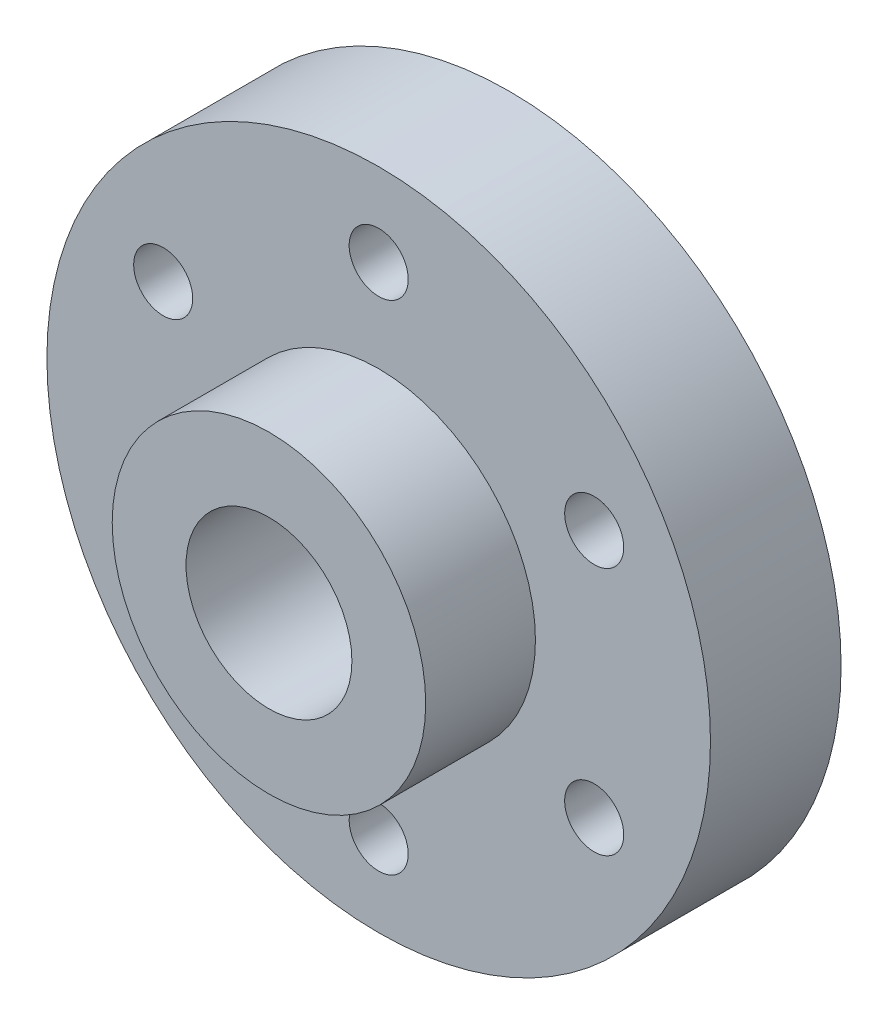
ISO-10303-21;
HEADER;
FILE_DESCRIPTION(('STEP AP214'),'2;1');
FILE_NAME('part.step','',(''),(''),'','','');
FILE_SCHEMA(('AUTOMOTIVE_DESIGN { 1 0 10303 214 1 1 1 1 }'));
ENDSEC;
DATA;
#1=APPLICATION_CONTEXT('core data for automotive mechanical design processes');
#2=APPLICATION_PROTOCOL_DEFINITION('international standard','automotive_design',2000,#1);
#3=PRODUCT_CONTEXT('',#1,'mechanical');
#4=PRODUCT('Part','Part','',(#3));
#5=PRODUCT_RELATED_PRODUCT_CATEGORY('part','',(#4));
#6=PRODUCT_DEFINITION_FORMATION('','',#4);
#7=PRODUCT_DEFINITION_CONTEXT('part definition',#1,'design');
#8=PRODUCT_DEFINITION('design','',#6,#7);
#9=PRODUCT_DEFINITION_SHAPE('','',#8);
#10=(LENGTH_UNIT() NAMED_UNIT(*) SI_UNIT(.MILLI.,.METRE.));
#11=(NAMED_UNIT(*) PLANE_ANGLE_UNIT() SI_UNIT($,.RADIAN.));
#12=(NAMED_UNIT(*) SI_UNIT($,.STERADIAN.) SOLID_ANGLE_UNIT());
#13=UNCERTAINTY_MEASURE_WITH_UNIT(LENGTH_MEASURE(1.E-05),#10,'distance_accuracy_value','');
#14=(GEOMETRIC_REPRESENTATION_CONTEXT(3) GLOBAL_UNCERTAINTY_ASSIGNED_CONTEXT((#13)) GLOBAL_UNIT_ASSIGNED_CONTEXT((#10,
#11,#12)) REPRESENTATION_CONTEXT('',''));
#15=CARTESIAN_POINT('',(0.,0.,0.));
#16=DIRECTION('',(0.,0.,1.));
#17=DIRECTION('',(1.,0.,0.));
#18=AXIS2_PLACEMENT_3D('',#15,#16,#17);
#19=CARTESIAN_POINT('',(0.,0.,5.));
#20=DIRECTION('',(0.,0.,1.));
#21=DIRECTION('',(1.,0.,0.));
#22=AXIS2_PLACEMENT_3D('',#19,#20,#21);
#23=PLANE('',#22);
#24=CARTESIAN_POINT('',(8.24889197104672,4.7625000000001,5.));
#25=DIRECTION('',(0.,0.,1.));
#26=DIRECTION('',(0.50000000000001,-0.866025403784433,0.));
#27=AXIS2_PLACEMENT_3D('',#24,#25,#26);
#28=CIRCLE('',#27,1.1303);
#29=CARTESIAN_POINT('',(8.81404197104673,3.78363148610255,5.));
#30=VERTEX_POINT('',#29);
#31=EDGE_CURVE('E72',#30,#30,#28,.T.);
#32=ORIENTED_EDGE('',*,*,#31,.F.);
#33=EDGE_LOOP('',(#32));
#34=FACE_BOUND('',#33,.T.);
#35=CARTESIAN_POINT('',(8.24889197104682,-4.76249999999992,5.));
#36=DIRECTION('',(0.,0.,1.));
#37=DIRECTION('',(-0.499999999999992,-0.866025403784443,0.));
#38=AXIS2_PLACEMENT_3D('',#35,#36,#37);
#39=CIRCLE('',#38,1.1303);
#40=CARTESIAN_POINT('',(7.68374197104683,-5.74136851389748,5.));
#41=VERTEX_POINT('',#40);
#42=EDGE_CURVE('E71',#41,#41,#39,.T.);
#43=ORIENTED_EDGE('',*,*,#42,.F.);
#44=EDGE_LOOP('',(#43));
#45=FACE_BOUND('',#44,.T.);
#46=CARTESIAN_POINT('',(0.,-9.525,5.));
#47=DIRECTION('',(0.,0.,1.));
#48=DIRECTION('',(-1.,0.,0.));
#49=AXIS2_PLACEMENT_3D('',#46,#47,#48);
#50=CIRCLE('',#49,1.1303);
#51=CARTESIAN_POINT('',(-1.1303,-9.525,5.));
#52=VERTEX_POINT('',#51);
#53=EDGE_CURVE('E78',#52,#52,#50,.T.);
#54=ORIENTED_EDGE('',*,*,#53,.F.);
#55=EDGE_LOOP('',(#54));
#56=FACE_BOUND('',#55,.T.);
#57=CARTESIAN_POINT('',(-8.24889197104676,-4.76250000000004,5.));
#58=DIRECTION('',(0.,0.,1.));
#59=DIRECTION('',(-0.500000000000004,0.866025403784436,0.));
#60=AXIS2_PLACEMENT_3D('',#57,#58,#59);
#61=CIRCLE('',#60,1.1303);
#62=CARTESIAN_POINT('',(-8.81404197104676,-3.78363148610249,5.));
#63=VERTEX_POINT('',#62);
#64=EDGE_CURVE('E84',#63,#63,#61,.T.);
#65=ORIENTED_EDGE('',*,*,#64,.F.);
#66=EDGE_LOOP('',(#65));
#67=FACE_BOUND('',#66,.T.);
#68=CARTESIAN_POINT('',(-8.24889197104679,4.76249999999998,5.));
#69=DIRECTION('',(0.,0.,1.));
#70=DIRECTION('',(0.499999999999998,0.86602540378444,0.));
#71=AXIS2_PLACEMENT_3D('',#68,#69,#70);
#72=CIRCLE('',#71,1.1303);
#73=CARTESIAN_POINT('',(-7.68374197104679,5.74136851389753,5.));
#74=VERTEX_POINT('',#73);
#75=EDGE_CURVE('E64',#74,#74,#72,.T.);
#76=ORIENTED_EDGE('',*,*,#75,.F.);
#77=EDGE_LOOP('',(#76));
#78=FACE_BOUND('',#77,.T.);
#79=CARTESIAN_POINT('',(0.,9.525,5.));
#80=DIRECTION('',(0.,0.,1.));
#81=DIRECTION('',(1.,0.,0.));
#82=AXIS2_PLACEMENT_3D('',#79,#80,#81);
#83=CIRCLE('',#82,1.1303);
#84=CARTESIAN_POINT('',(1.1303,9.525,5.));
#85=VERTEX_POINT('',#84);
#86=EDGE_CURVE('E58',#85,#85,#83,.T.);
#87=ORIENTED_EDGE('',*,*,#86,.F.);
#88=EDGE_LOOP('',(#87));
#89=FACE_BOUND('',#88,.T.);
#90=CARTESIAN_POINT('',(0.,0.,5.));
#91=DIRECTION('',(0.,0.,1.));
#92=DIRECTION('',(1.,0.,0.));
#93=AXIS2_PLACEMENT_3D('',#90,#91,#92);
#94=CIRCLE('',#93,12.7);
#95=CARTESIAN_POINT('',(12.7,0.,5.));
#96=VERTEX_POINT('',#95);
#97=EDGE_CURVE('E10',#96,#96,#94,.T.);
#98=ORIENTED_EDGE('',*,*,#97,.T.);
#99=EDGE_LOOP('',(#98));
#100=FACE_BOUND('',#99,.T.);
#101=CARTESIAN_POINT('',(0.,0.,5.));
#102=DIRECTION('',(0.,0.,1.));
#103=DIRECTION('',(1.,0.,0.));
#104=AXIS2_PLACEMENT_3D('',#101,#102,#103);
#105=CIRCLE('',#104,6.);
#106=CARTESIAN_POINT('',(6.,0.,5.));
#107=VERTEX_POINT('',#106);
#108=EDGE_CURVE('E47',#107,#107,#105,.T.);
#109=ORIENTED_EDGE('',*,*,#108,.F.);
#110=EDGE_LOOP('',(#109));
#111=FACE_BOUND('',#110,.T.);
#112=ADVANCED_FACE('F31',(#34,#45,#56,#67,#78,#89,#100,#111),#23,.T.);
#113=CARTESIAN_POINT('',(0.,0.,0.));
#114=DIRECTION('',(0.,0.,1.));
#115=DIRECTION('',(1.,0.,0.));
#116=AXIS2_PLACEMENT_3D('',#113,#114,#115);
#117=PLANE('',#116);
#118=CARTESIAN_POINT('',(8.24889197104672,4.7625000000001,0.));
#119=DIRECTION('',(0.,0.,1.));
#120=DIRECTION('',(1.,0.,0.));
#121=AXIS2_PLACEMENT_3D('',#118,#119,#120);
#122=CIRCLE('',#121,1.1303);
#123=CARTESIAN_POINT('',(9.37919197104672,4.7625000000001,0.));
#124=VERTEX_POINT('',#123);
#125=EDGE_CURVE('E68',#124,#124,#122,.F.);
#126=ORIENTED_EDGE('',*,*,#125,.F.);
#127=EDGE_LOOP('',(#126));
#128=FACE_BOUND('',#127,.T.);
#129=CARTESIAN_POINT('',(8.24889197104682,-4.76249999999992,0.));
#130=DIRECTION('',(0.,0.,1.));
#131=DIRECTION('',(1.,0.,0.));
#132=AXIS2_PLACEMENT_3D('',#129,#130,#131);
#133=CIRCLE('',#132,1.1303);
#134=CARTESIAN_POINT('',(9.37919197104682,-4.76249999999992,0.));
#135=VERTEX_POINT('',#134);
#136=EDGE_CURVE('E75',#135,#135,#133,.F.);
#137=ORIENTED_EDGE('',*,*,#136,.F.);
#138=EDGE_LOOP('',(#137));
#139=FACE_BOUND('',#138,.T.);
#140=CARTESIAN_POINT('',(0.,-9.525,0.));
#141=DIRECTION('',(0.,0.,1.));
#142=DIRECTION('',(1.,0.,0.));
#143=AXIS2_PLACEMENT_3D('',#140,#141,#142);
#144=CIRCLE('',#143,1.1303);
#145=CARTESIAN_POINT('',(1.1303,-9.525,0.));
#146=VERTEX_POINT('',#145);
#147=EDGE_CURVE('E81',#146,#146,#144,.F.);
#148=ORIENTED_EDGE('',*,*,#147,.F.);
#149=EDGE_LOOP('',(#148));
#150=FACE_BOUND('',#149,.T.);
#151=CARTESIAN_POINT('',(-8.24889197104676,-4.76250000000004,0.));
#152=DIRECTION('',(0.,0.,1.));
#153=DIRECTION('',(1.,0.,0.));
#154=AXIS2_PLACEMENT_3D('',#151,#152,#153);
#155=CIRCLE('',#154,1.1303);
#156=CARTESIAN_POINT('',(-7.11859197104676,-4.76250000000004,0.));
#157=VERTEX_POINT('',#156);
#158=EDGE_CURVE('E67',#157,#157,#155,.F.);
#159=ORIENTED_EDGE('',*,*,#158,.F.);
#160=EDGE_LOOP('',(#159));
#161=FACE_BOUND('',#160,.T.);
#162=CARTESIAN_POINT('',(-8.24889197104679,4.76249999999998,0.));
#163=DIRECTION('',(0.,0.,1.));
#164=DIRECTION('',(1.,0.,0.));
#165=AXIS2_PLACEMENT_3D('',#162,#163,#164);
#166=CIRCLE('',#165,1.1303);
#167=CARTESIAN_POINT('',(-7.11859197104679,4.76249999999998,0.));
#168=VERTEX_POINT('',#167);
#169=EDGE_CURVE('E61',#168,#168,#166,.F.);
#170=ORIENTED_EDGE('',*,*,#169,.F.);
#171=EDGE_LOOP('',(#170));
#172=FACE_BOUND('',#171,.T.);
#173=CARTESIAN_POINT('',(0.,9.525,0.));
#174=DIRECTION('',(0.,0.,1.));
#175=DIRECTION('',(1.,0.,0.));
#176=AXIS2_PLACEMENT_3D('',#173,#174,#175);
#177=CIRCLE('',#176,1.1303);
#178=CARTESIAN_POINT('',(1.1303,9.525,0.));
#179=VERTEX_POINT('',#178);
#180=EDGE_CURVE('E55',#179,#179,#177,.F.);
#181=ORIENTED_EDGE('',*,*,#180,.F.);
#182=EDGE_LOOP('',(#181));
#183=FACE_BOUND('',#182,.T.);
#184=CARTESIAN_POINT('',(0.,0.,0.));
#185=DIRECTION('',(0.,0.,1.));
#186=DIRECTION('',(1.,0.,0.));
#187=AXIS2_PLACEMENT_3D('',#184,#185,#186);
#188=CIRCLE('',#187,12.7);
#189=CARTESIAN_POINT('',(12.7,0.,0.));
#190=VERTEX_POINT('',#189);
#191=EDGE_CURVE('E35',#190,#190,#188,.T.);
#192=ORIENTED_EDGE('',*,*,#191,.F.);
#193=EDGE_LOOP('',(#192));
#194=FACE_BOUND('',#193,.T.);
#195=CARTESIAN_POINT('',(0.,0.,0.));
#196=DIRECTION('',(0.,0.,1.));
#197=DIRECTION('',(1.,0.,0.));
#198=AXIS2_PLACEMENT_3D('',#195,#196,#197);
#199=CIRCLE('',#198,3.175);
#200=CARTESIAN_POINT('',(3.175,0.,0.));
#201=VERTEX_POINT('',#200);
#202=EDGE_CURVE('E42',#201,#201,#199,.T.);
#203=ORIENTED_EDGE('',*,*,#202,.T.);
#204=EDGE_LOOP('',(#203));
#205=FACE_BOUND('',#204,.T.);
#206=ADVANCED_FACE('F97',(#128,#139,#150,#161,#172,#183,#194,#205),#117,.F.);
#207=CARTESIAN_POINT('',(0.,0.,5.));
#208=DIRECTION('',(0.,0.,-1.));
#209=DIRECTION('',(-1.,0.,0.));
#210=AXIS2_PLACEMENT_3D('',#207,#208,#209);
#211=CYLINDRICAL_SURFACE('',#210,12.7);
#212=ORIENTED_EDGE('',*,*,#97,.F.);
#213=EDGE_LOOP('',(#212));
#214=FACE_BOUND('',#213,.T.);
#215=ORIENTED_EDGE('',*,*,#191,.T.);
#216=EDGE_LOOP('',(#215));
#217=FACE_BOUND('',#216,.T.);
#218=ADVANCED_FACE('F33',(#214,#217),#211,.T.);
#219=CARTESIAN_POINT('',(0.,0.,5.));
#220=DIRECTION('',(0.,0.,-1.));
#221=DIRECTION('',(-1.,0.,0.));
#222=AXIS2_PLACEMENT_3D('',#219,#220,#221);
#223=CYLINDRICAL_SURFACE('',#222,3.175);
#224=ORIENTED_EDGE('',*,*,#202,.F.);
#225=EDGE_LOOP('',(#224));
#226=FACE_BOUND('',#225,.T.);
#227=CARTESIAN_POINT('',(0.,0.,9.2));
#228=DIRECTION('',(0.,0.,1.));
#229=DIRECTION('',(1.,0.,0.));
#230=AXIS2_PLACEMENT_3D('',#227,#228,#229);
#231=CIRCLE('',#230,3.175);
#232=CARTESIAN_POINT('',(3.175,0.,9.2));
#233=VERTEX_POINT('',#232);
#234=EDGE_CURVE('E50',#233,#233,#231,.T.);
#235=ORIENTED_EDGE('',*,*,#234,.T.);
#236=EDGE_LOOP('',(#235));
#237=FACE_BOUND('',#236,.T.);
#238=ADVANCED_FACE('F119',(#226,#237),#223,.F.);
#239=CARTESIAN_POINT('',(0.,0.,9.2));
#240=DIRECTION('',(0.,0.,1.));
#241=DIRECTION('',(1.,0.,0.));
#242=AXIS2_PLACEMENT_3D('',#239,#240,#241);
#243=PLANE('',#242);
#244=CARTESIAN_POINT('',(0.,0.,9.2));
#245=DIRECTION('',(0.,0.,1.));
#246=DIRECTION('',(1.,0.,0.));
#247=AXIS2_PLACEMENT_3D('',#244,#245,#246);
#248=CIRCLE('',#247,6.);
#249=CARTESIAN_POINT('',(6.,0.,9.2));
#250=VERTEX_POINT('',#249);
#251=EDGE_CURVE('E46',#250,#250,#248,.T.);
#252=ORIENTED_EDGE('',*,*,#251,.T.);
#253=EDGE_LOOP('',(#252));
#254=FACE_BOUND('',#253,.T.);
#255=ORIENTED_EDGE('',*,*,#234,.F.);
#256=EDGE_LOOP('',(#255));
#257=FACE_BOUND('',#256,.T.);
#258=ADVANCED_FACE('F109',(#254,#257),#243,.T.);
#259=CARTESIAN_POINT('',(0.,0.,9.2));
#260=DIRECTION('',(0.,0.,-1.));
#261=DIRECTION('',(-1.,0.,0.));
#262=AXIS2_PLACEMENT_3D('',#259,#260,#261);
#263=CYLINDRICAL_SURFACE('',#262,6.);
#264=ORIENTED_EDGE('',*,*,#251,.F.);
#265=EDGE_LOOP('',(#264));
#266=FACE_BOUND('',#265,.T.);
#267=ORIENTED_EDGE('',*,*,#108,.T.);
#268=EDGE_LOOP('',(#267));
#269=FACE_BOUND('',#268,.T.);
#270=ADVANCED_FACE('F106',(#266,#269),#263,.T.);
#271=CARTESIAN_POINT('',(0.,9.525,-0.00100000000000013));
#272=DIRECTION('',(0.,0.,1.));
#273=DIRECTION('',(1.,0.,0.));
#274=AXIS2_PLACEMENT_3D('',#271,#272,#273);
#275=CYLINDRICAL_SURFACE('',#274,1.1303);
#276=ORIENTED_EDGE('',*,*,#86,.T.);
#277=EDGE_LOOP('',(#276));
#278=FACE_BOUND('',#277,.T.);
#279=ORIENTED_EDGE('',*,*,#180,.T.);
#280=EDGE_LOOP('',(#279));
#281=FACE_BOUND('',#280,.T.);
#282=ADVANCED_FACE('F108',(#278,#281),#275,.F.);
#283=CARTESIAN_POINT('',(-8.24889197104679,4.76249999999998,-0.00100000000000013));
#284=DIRECTION('',(0.,0.,1.));
#285=DIRECTION('',(1.,0.,0.));
#286=AXIS2_PLACEMENT_3D('',#283,#284,#285);
#287=CYLINDRICAL_SURFACE('',#286,1.1303);
#288=ORIENTED_EDGE('',*,*,#75,.T.);
#289=EDGE_LOOP('',(#288));
#290=FACE_BOUND('',#289,.T.);
#291=ORIENTED_EDGE('',*,*,#169,.T.);
#292=EDGE_LOOP('',(#291));
#293=FACE_BOUND('',#292,.T.);
#294=ADVANCED_FACE('F116',(#290,#293),#287,.F.);
#295=CARTESIAN_POINT('',(-8.24889197104676,-4.76250000000004,-0.00100000000000013));
#296=DIRECTION('',(0.,0.,1.));
#297=DIRECTION('',(1.,0.,0.));
#298=AXIS2_PLACEMENT_3D('',#295,#296,#297);
#299=CYLINDRICAL_SURFACE('',#298,1.1303);
#300=ORIENTED_EDGE('',*,*,#64,.T.);
#301=EDGE_LOOP('',(#300));
#302=FACE_BOUND('',#301,.T.);
#303=ORIENTED_EDGE('',*,*,#158,.T.);
#304=EDGE_LOOP('',(#303));
#305=FACE_BOUND('',#304,.T.);
#306=ADVANCED_FACE('F92',(#302,#305),#299,.F.);
#307=CARTESIAN_POINT('',(0.,-9.525,-0.00100000000000013));
#308=DIRECTION('',(0.,0.,1.));
#309=DIRECTION('',(1.,0.,0.));
#310=AXIS2_PLACEMENT_3D('',#307,#308,#309);
#311=CYLINDRICAL_SURFACE('',#310,1.1303);
#312=ORIENTED_EDGE('',*,*,#53,.T.);
#313=EDGE_LOOP('',(#312));
#314=FACE_BOUND('',#313,.T.);
#315=ORIENTED_EDGE('',*,*,#147,.T.);
#316=EDGE_LOOP('',(#315));
#317=FACE_BOUND('',#316,.T.);
#318=ADVANCED_FACE('F159',(#314,#317),#311,.F.);
#319=CARTESIAN_POINT('',(8.24889197104682,-4.76249999999992,-0.00100000000000013));
#320=DIRECTION('',(0.,0.,1.));
#321=DIRECTION('',(1.,0.,0.));
#322=AXIS2_PLACEMENT_3D('',#319,#320,#321);
#323=CYLINDRICAL_SURFACE('',#322,1.1303);
#324=ORIENTED_EDGE('',*,*,#42,.T.);
#325=EDGE_LOOP('',(#324));
#326=FACE_BOUND('',#325,.T.);
#327=ORIENTED_EDGE('',*,*,#136,.T.);
#328=EDGE_LOOP('',(#327));
#329=FACE_BOUND('',#328,.T.);
#330=ADVANCED_FACE('F165',(#326,#329),#323,.F.);
#331=CARTESIAN_POINT('',(8.24889197104672,4.7625000000001,-0.00100000000000013));
#332=DIRECTION('',(0.,0.,1.));
#333=DIRECTION('',(1.,0.,0.));
#334=AXIS2_PLACEMENT_3D('',#331,#332,#333);
#335=CYLINDRICAL_SURFACE('',#334,1.1303);
#336=ORIENTED_EDGE('',*,*,#31,.T.);
#337=EDGE_LOOP('',(#336));
#338=FACE_BOUND('',#337,.T.);
#339=ORIENTED_EDGE('',*,*,#125,.T.);
#340=EDGE_LOOP('',(#339));
#341=FACE_BOUND('',#340,.T.);
#342=ADVANCED_FACE('F162',(#338,#341),#335,.F.);
#343=CLOSED_SHELL('',(#112,#206,#218,#238,#258,#270,#282,#294,#306,#318,#330,#342));
#344=MANIFOLD_SOLID_BREP('B2',#343);
#345=ADVANCED_BREP_SHAPE_REPRESENTATION('',(#18,#344),#14);
#346=SHAPE_DEFINITION_REPRESENTATION(#9,#345);
ENDSEC;
END-ISO-10303-21;
